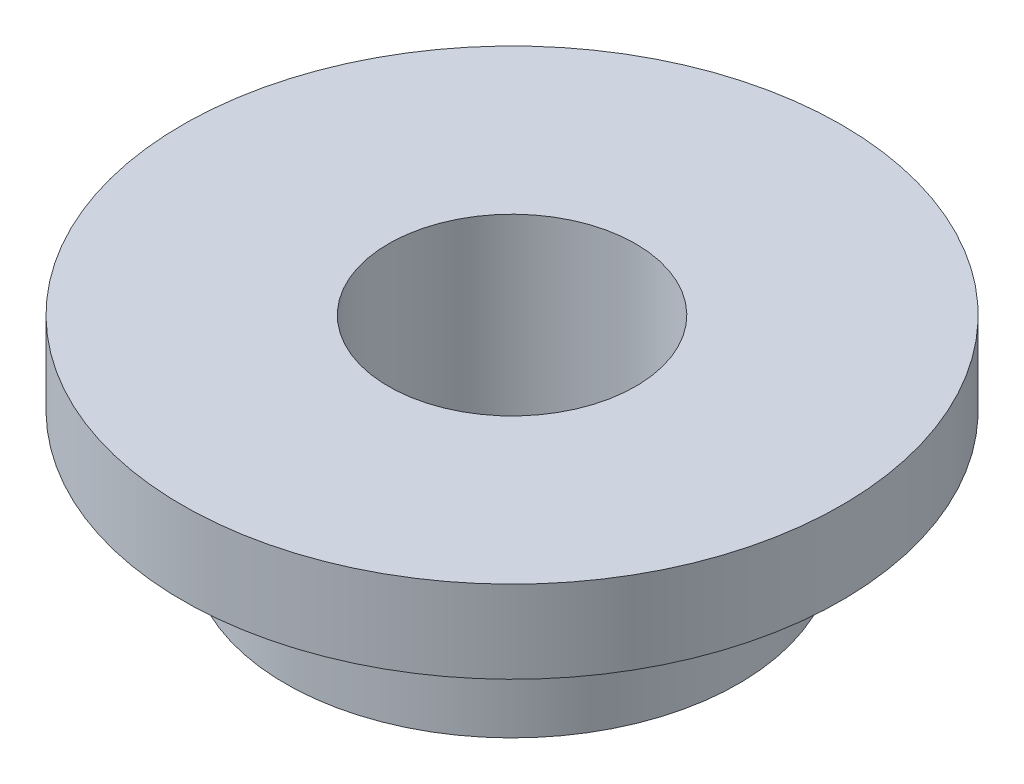
ISO-10303-21;
HEADER;
FILE_DESCRIPTION(('STEP AP214'),'2;1');
FILE_NAME('part.step','',(''),(''),'','','');
FILE_SCHEMA(('AUTOMOTIVE_DESIGN { 1 0 10303 214 1 1 1 1 }'));
ENDSEC;
DATA;
#1=APPLICATION_CONTEXT('core data for automotive mechanical design processes');
#2=APPLICATION_PROTOCOL_DEFINITION('international standard','automotive_design',2000,#1);
#3=PRODUCT_CONTEXT('',#1,'mechanical');
#4=PRODUCT('Part','Part','',(#3));
#5=PRODUCT_RELATED_PRODUCT_CATEGORY('part','',(#4));
#6=PRODUCT_DEFINITION_FORMATION('','',#4);
#7=PRODUCT_DEFINITION_CONTEXT('part definition',#1,'design');
#8=PRODUCT_DEFINITION('design','',#6,#7);
#9=PRODUCT_DEFINITION_SHAPE('','',#8);
#10=(LENGTH_UNIT() NAMED_UNIT(*) SI_UNIT(.MILLI.,.METRE.));
#11=(NAMED_UNIT(*) PLANE_ANGLE_UNIT() SI_UNIT($,.RADIAN.));
#12=(NAMED_UNIT(*) SI_UNIT($,.STERADIAN.) SOLID_ANGLE_UNIT());
#13=UNCERTAINTY_MEASURE_WITH_UNIT(LENGTH_MEASURE(1.E-05),#10,'distance_accuracy_value','');
#14=(GEOMETRIC_REPRESENTATION_CONTEXT(3) GLOBAL_UNCERTAINTY_ASSIGNED_CONTEXT((#13)) GLOBAL_UNIT_ASSIGNED_CONTEXT((#10,
#11,#12)) REPRESENTATION_CONTEXT('',''));
#15=CARTESIAN_POINT('',(0.,0.,0.));
#16=DIRECTION('',(0.,0.,1.));
#17=DIRECTION('',(1.,0.,0.));
#18=AXIS2_PLACEMENT_3D('',#15,#16,#17);
#19=CARTESIAN_POINT('',(0.,0.,-11.));
#20=DIRECTION('',(0.,-1.,0.));
#21=DIRECTION('',(0.,0.,-1.));
#22=AXIS2_PLACEMENT_3D('',#19,#20,#21);
#23=PLANE('',#22);
#24=CARTESIAN_POINT('',(0.,0.,0.));
#25=DIRECTION('',(0.,-1.,0.));
#26=DIRECTION('',(0.,0.,-1.));
#27=AXIS2_PLACEMENT_3D('',#24,#25,#26);
#28=CIRCLE('',#27,11.);
#29=CARTESIAN_POINT('',(0.,0.,-11.));
#30=VERTEX_POINT('',#29);
#31=EDGE_CURVE('E56',#30,#30,#28,.T.);
#32=ORIENTED_EDGE('',*,*,#31,.T.);
#33=EDGE_LOOP('',(#32));
#34=FACE_BOUND('',#33,.T.);
#35=CARTESIAN_POINT('',(0.,0.,0.));
#36=DIRECTION('',(0.,-1.,0.));
#37=DIRECTION('',(0.,0.,-1.));
#38=AXIS2_PLACEMENT_3D('',#35,#36,#37);
#39=CIRCLE('',#38,6.);
#40=CARTESIAN_POINT('',(0.,0.,-6.));
#41=VERTEX_POINT('',#40);
#42=EDGE_CURVE('E10',#41,#41,#39,.T.);
#43=ORIENTED_EDGE('',*,*,#42,.F.);
#44=EDGE_LOOP('',(#43));
#45=FACE_BOUND('',#44,.T.);
#46=ADVANCED_FACE('F34',(#34,#45),#23,.T.);
#47=CARTESIAN_POINT('',(0.,0.,0.));
#48=DIRECTION('',(0.,-1.,0.));
#49=DIRECTION('',(0.,0.,-1.));
#50=AXIS2_PLACEMENT_3D('',#47,#48,#49);
#51=CYLINDRICAL_SURFACE('',#50,6.);
#52=ORIENTED_EDGE('',*,*,#42,.T.);
#53=EDGE_LOOP('',(#52));
#54=FACE_BOUND('',#53,.T.);
#55=CARTESIAN_POINT('',(0.,10.,0.));
#56=DIRECTION('',(0.,-1.,0.));
#57=DIRECTION('',(0.,0.,-1.));
#58=AXIS2_PLACEMENT_3D('',#55,#56,#57);
#59=CIRCLE('',#58,6.);
#60=CARTESIAN_POINT('',(0.,10.,-6.));
#61=VERTEX_POINT('',#60);
#62=EDGE_CURVE('E40',#61,#61,#59,.T.);
#63=ORIENTED_EDGE('',*,*,#62,.F.);
#64=EDGE_LOOP('',(#63));
#65=FACE_BOUND('',#64,.T.);
#66=ADVANCED_FACE('F74',(#54,#65),#51,.F.);
#67=CARTESIAN_POINT('',(0.,10.,-6.));
#68=DIRECTION('',(0.,1.,0.));
#69=DIRECTION('',(0.,0.,1.));
#70=AXIS2_PLACEMENT_3D('',#67,#68,#69);
#71=PLANE('',#70);
#72=ORIENTED_EDGE('',*,*,#62,.T.);
#73=EDGE_LOOP('',(#72));
#74=FACE_BOUND('',#73,.T.);
#75=CARTESIAN_POINT('',(0.,10.,0.));
#76=DIRECTION('',(0.,-1.,0.));
#77=DIRECTION('',(0.,0.,-1.));
#78=AXIS2_PLACEMENT_3D('',#75,#76,#77);
#79=CIRCLE('',#78,16.);
#80=CARTESIAN_POINT('',(0.,10.,-16.));
#81=VERTEX_POINT('',#80);
#82=EDGE_CURVE('E44',#81,#81,#79,.T.);
#83=ORIENTED_EDGE('',*,*,#82,.F.);
#84=EDGE_LOOP('',(#83));
#85=FACE_BOUND('',#84,.T.);
#86=ADVANCED_FACE('F78',(#74,#85),#71,.T.);
#87=CARTESIAN_POINT('',(0.,0.,0.));
#88=DIRECTION('',(0.,-1.,0.));
#89=DIRECTION('',(0.,0.,-1.));
#90=AXIS2_PLACEMENT_3D('',#87,#88,#89);
#91=CYLINDRICAL_SURFACE('',#90,16.);
#92=ORIENTED_EDGE('',*,*,#82,.T.);
#93=EDGE_LOOP('',(#92));
#94=FACE_BOUND('',#93,.T.);
#95=CARTESIAN_POINT('',(0.,6.,0.));
#96=DIRECTION('',(0.,-1.,0.));
#97=DIRECTION('',(0.,0.,-1.));
#98=AXIS2_PLACEMENT_3D('',#95,#96,#97);
#99=CIRCLE('',#98,16.);
#100=CARTESIAN_POINT('',(0.,6.,-16.));
#101=VERTEX_POINT('',#100);
#102=EDGE_CURVE('E48',#101,#101,#99,.T.);
#103=ORIENTED_EDGE('',*,*,#102,.F.);
#104=EDGE_LOOP('',(#103));
#105=FACE_BOUND('',#104,.T.);
#106=ADVANCED_FACE('F70',(#94,#105),#91,.T.);
#107=CARTESIAN_POINT('',(0.,6.,-16.));
#108=DIRECTION('',(0.,-1.,0.));
#109=DIRECTION('',(0.,0.,-1.));
#110=AXIS2_PLACEMENT_3D('',#107,#108,#109);
#111=PLANE('',#110);
#112=ORIENTED_EDGE('',*,*,#102,.T.);
#113=EDGE_LOOP('',(#112));
#114=FACE_BOUND('',#113,.T.);
#115=CARTESIAN_POINT('',(0.,6.,0.));
#116=DIRECTION('',(0.,-1.,0.));
#117=DIRECTION('',(0.,0.,-1.));
#118=AXIS2_PLACEMENT_3D('',#115,#116,#117);
#119=CIRCLE('',#118,11.);
#120=CARTESIAN_POINT('',(0.,6.,-11.));
#121=VERTEX_POINT('',#120);
#122=EDGE_CURVE('E53',#121,#121,#119,.T.);
#123=ORIENTED_EDGE('',*,*,#122,.F.);
#124=EDGE_LOOP('',(#123));
#125=FACE_BOUND('',#124,.T.);
#126=ADVANCED_FACE('F64',(#114,#125),#111,.T.);
#127=CARTESIAN_POINT('',(0.,0.,0.));
#128=DIRECTION('',(0.,-1.,0.));
#129=DIRECTION('',(0.,0.,-1.));
#130=AXIS2_PLACEMENT_3D('',#127,#128,#129);
#131=CYLINDRICAL_SURFACE('',#130,11.);
#132=ORIENTED_EDGE('',*,*,#122,.T.);
#133=EDGE_LOOP('',(#132));
#134=FACE_BOUND('',#133,.T.);
#135=ORIENTED_EDGE('',*,*,#31,.F.);
#136=EDGE_LOOP('',(#135));
#137=FACE_BOUND('',#136,.T.);
#138=ADVANCED_FACE('F62',(#134,#137),#131,.T.);
#139=CLOSED_SHELL('',(#46,#66,#86,#106,#126,#138));
#140=MANIFOLD_SOLID_BREP('B2',#139);
#141=ADVANCED_BREP_SHAPE_REPRESENTATION('',(#18,#140),#14);
#142=SHAPE_DEFINITION_REPRESENTATION(#9,#141);
ENDSEC;
END-ISO-10303-21;
